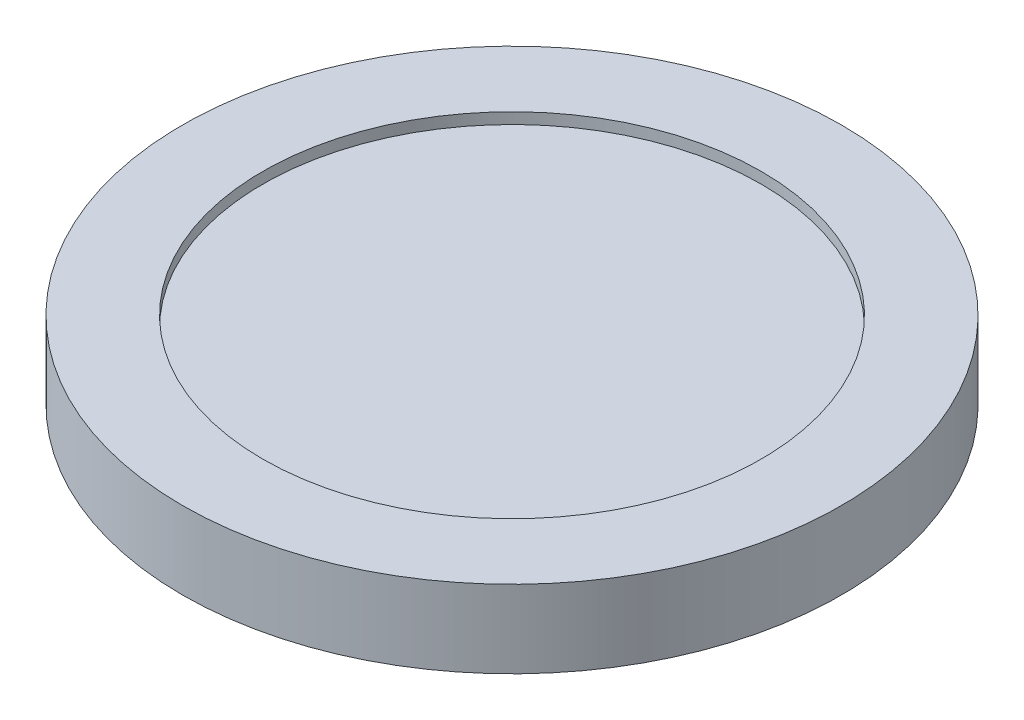
ISO-10303-21;
HEADER;
FILE_DESCRIPTION(('STEP AP214'),'2;1');
FILE_NAME('part.step','',(''),(''),'','','');
FILE_SCHEMA(('AUTOMOTIVE_DESIGN { 1 0 10303 214 1 1 1 1 }'));
ENDSEC;
DATA;
#1=APPLICATION_CONTEXT('core data for automotive mechanical design processes');
#2=APPLICATION_PROTOCOL_DEFINITION('international standard','automotive_design',2000,#1);
#3=PRODUCT_CONTEXT('',#1,'mechanical');
#4=PRODUCT('Part','Part','',(#3));
#5=PRODUCT_RELATED_PRODUCT_CATEGORY('part','',(#4));
#6=PRODUCT_DEFINITION_FORMATION('','',#4);
#7=PRODUCT_DEFINITION_CONTEXT('part definition',#1,'design');
#8=PRODUCT_DEFINITION('design','',#6,#7);
#9=PRODUCT_DEFINITION_SHAPE('','',#8);
#10=(LENGTH_UNIT() NAMED_UNIT(*) SI_UNIT(.MILLI.,.METRE.));
#11=(NAMED_UNIT(*) PLANE_ANGLE_UNIT() SI_UNIT($,.RADIAN.));
#12=(NAMED_UNIT(*) SI_UNIT($,.STERADIAN.) SOLID_ANGLE_UNIT());
#13=UNCERTAINTY_MEASURE_WITH_UNIT(LENGTH_MEASURE(1.E-05),#10,'distance_accuracy_value','');
#14=(GEOMETRIC_REPRESENTATION_CONTEXT(3) GLOBAL_UNCERTAINTY_ASSIGNED_CONTEXT((#13)) GLOBAL_UNIT_ASSIGNED_CONTEXT((#10,
#11,#12)) REPRESENTATION_CONTEXT('',''));
#15=CARTESIAN_POINT('',(0.,0.,0.));
#16=DIRECTION('',(0.,0.,1.));
#17=DIRECTION('',(1.,0.,0.));
#18=AXIS2_PLACEMENT_3D('',#15,#16,#17);
#19=CARTESIAN_POINT('',(0.,2.8,0.));
#20=DIRECTION('',(0.,-1.,0.));
#21=DIRECTION('',(0.,0.,-1.));
#22=AXIS2_PLACEMENT_3D('',#19,#20,#21);
#23=CYLINDRICAL_SURFACE('',#22,11.9);
#24=CARTESIAN_POINT('',(0.,2.8,0.));
#25=DIRECTION('',(0.,1.,0.));
#26=DIRECTION('',(0.,0.,1.));
#27=AXIS2_PLACEMENT_3D('',#24,#25,#26);
#28=CIRCLE('',#27,11.9);
#29=CARTESIAN_POINT('',(0.,2.8,11.9));
#30=VERTEX_POINT('',#29);
#31=EDGE_CURVE('E10',#30,#30,#28,.T.);
#32=ORIENTED_EDGE('',*,*,#31,.F.);
#33=EDGE_LOOP('',(#32));
#34=FACE_BOUND('',#33,.T.);
#35=CARTESIAN_POINT('',(0.,0.,0.));
#36=DIRECTION('',(0.,1.,0.));
#37=DIRECTION('',(0.,0.,1.));
#38=AXIS2_PLACEMENT_3D('',#35,#36,#37);
#39=CIRCLE('',#38,11.9);
#40=CARTESIAN_POINT('',(0.,0.,11.9));
#41=VERTEX_POINT('',#40);
#42=EDGE_CURVE('E42',#41,#41,#39,.T.);
#43=ORIENTED_EDGE('',*,*,#42,.T.);
#44=EDGE_LOOP('',(#43));
#45=FACE_BOUND('',#44,.T.);
#46=ADVANCED_FACE('F39',(#34,#45),#23,.T.);
#47=CARTESIAN_POINT('',(0.,2.8,0.));
#48=DIRECTION('',(0.,1.,0.));
#49=DIRECTION('',(0.,0.,1.));
#50=AXIS2_PLACEMENT_3D('',#47,#48,#49);
#51=PLANE('',#50);
#52=CARTESIAN_POINT('',(0.,2.8,0.));
#53=DIRECTION('',(0.,1.,0.));
#54=DIRECTION('',(0.,0.,1.));
#55=AXIS2_PLACEMENT_3D('',#52,#53,#54);
#56=CIRCLE('',#55,9.);
#57=CARTESIAN_POINT('',(0.,2.8,9.));
#58=VERTEX_POINT('',#57);
#59=EDGE_CURVE('E51',#58,#58,#56,.T.);
#60=ORIENTED_EDGE('',*,*,#59,.F.);
#61=EDGE_LOOP('',(#60));
#62=FACE_BOUND('',#61,.T.);
#63=ORIENTED_EDGE('',*,*,#31,.T.);
#64=EDGE_LOOP('',(#63));
#65=FACE_BOUND('',#64,.T.);
#66=ADVANCED_FACE('F66',(#62,#65),#51,.T.);
#67=CARTESIAN_POINT('',(0.,0.,0.));
#68=DIRECTION('',(0.,1.,0.));
#69=DIRECTION('',(0.,0.,1.));
#70=AXIS2_PLACEMENT_3D('',#67,#68,#69);
#71=PLANE('',#70);
#72=ORIENTED_EDGE('',*,*,#42,.F.);
#73=EDGE_LOOP('',(#72));
#74=FACE_BOUND('',#73,.T.);
#75=ADVANCED_FACE('F62',(#74),#71,.F.);
#76=CARTESIAN_POINT('',(0.,2.4,0.));
#77=DIRECTION('',(0.,1.,0.));
#78=DIRECTION('',(0.,0.,1.));
#79=AXIS2_PLACEMENT_3D('',#76,#77,#78);
#80=CYLINDRICAL_SURFACE('',#79,9.);
#81=CARTESIAN_POINT('',(0.,2.4,0.));
#82=DIRECTION('',(0.,1.,0.));
#83=DIRECTION('',(0.,0.,1.));
#84=AXIS2_PLACEMENT_3D('',#81,#82,#83);
#85=CIRCLE('',#84,9.);
#86=CARTESIAN_POINT('',(0.,2.4,9.));
#87=VERTEX_POINT('',#86);
#88=EDGE_CURVE('E49',#87,#87,#85,.T.);
#89=ORIENTED_EDGE('',*,*,#88,.F.);
#90=EDGE_LOOP('',(#89));
#91=FACE_BOUND('',#90,.T.);
#92=ORIENTED_EDGE('',*,*,#59,.T.);
#93=EDGE_LOOP('',(#92));
#94=FACE_BOUND('',#93,.T.);
#95=ADVANCED_FACE('F59',(#91,#94),#80,.F.);
#96=CARTESIAN_POINT('',(0.,2.4,0.));
#97=DIRECTION('',(0.,1.,0.));
#98=DIRECTION('',(0.,0.,1.));
#99=AXIS2_PLACEMENT_3D('',#96,#97,#98);
#100=PLANE('',#99);
#101=ORIENTED_EDGE('',*,*,#88,.T.);
#102=EDGE_LOOP('',(#101));
#103=FACE_BOUND('',#102,.T.);
#104=ADVANCED_FACE('F57',(#103),#100,.T.);
#105=CLOSED_SHELL('',(#46,#66,#75,#95,#104));
#106=MANIFOLD_SOLID_BREP('B2',#105);
#107=ADVANCED_BREP_SHAPE_REPRESENTATION('',(#18,#106),#14);
#108=SHAPE_DEFINITION_REPRESENTATION(#9,#107);
ENDSEC;
END-ISO-10303-21;
